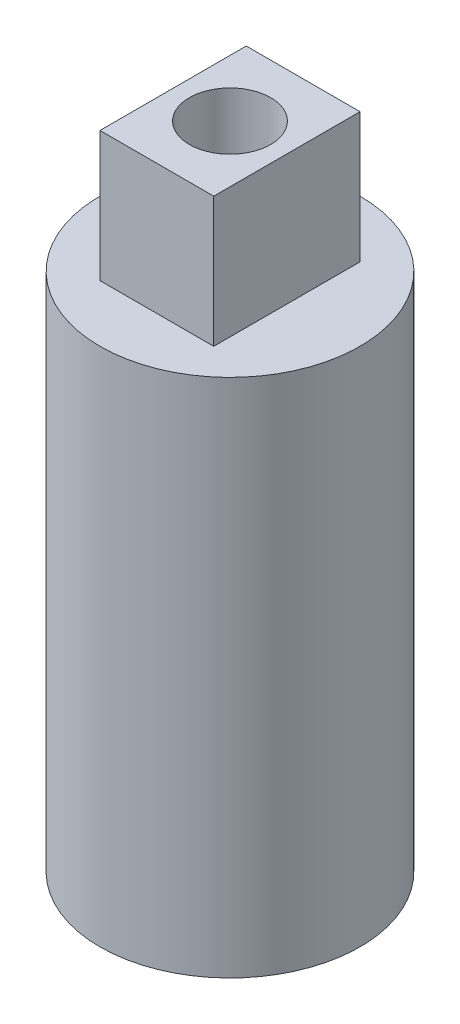
ISO-10303-21;
HEADER;
FILE_DESCRIPTION(('STEP AP214'),'2;1');
FILE_NAME('part.step','',(''),(''),'','','');
FILE_SCHEMA(('AUTOMOTIVE_DESIGN { 1 0 10303 214 1 1 1 1 }'));
ENDSEC;
DATA;
#1=APPLICATION_CONTEXT('core data for automotive mechanical design processes');
#2=APPLICATION_PROTOCOL_DEFINITION('international standard','automotive_design',2000,#1);
#3=PRODUCT_CONTEXT('',#1,'mechanical');
#4=PRODUCT('Part','Part','',(#3));
#5=PRODUCT_RELATED_PRODUCT_CATEGORY('part','',(#4));
#6=PRODUCT_DEFINITION_FORMATION('','',#4);
#7=PRODUCT_DEFINITION_CONTEXT('part definition',#1,'design');
#8=PRODUCT_DEFINITION('design','',#6,#7);
#9=PRODUCT_DEFINITION_SHAPE('','',#8);
#10=(LENGTH_UNIT() NAMED_UNIT(*) SI_UNIT(.MILLI.,.METRE.));
#11=(NAMED_UNIT(*) PLANE_ANGLE_UNIT() SI_UNIT($,.RADIAN.));
#12=(NAMED_UNIT(*) SI_UNIT($,.STERADIAN.) SOLID_ANGLE_UNIT());
#13=UNCERTAINTY_MEASURE_WITH_UNIT(LENGTH_MEASURE(1.E-05),#10,'distance_accuracy_value','');
#14=(GEOMETRIC_REPRESENTATION_CONTEXT(3) GLOBAL_UNCERTAINTY_ASSIGNED_CONTEXT((#13)) GLOBAL_UNIT_ASSIGNED_CONTEXT((#10,
#11,#12)) REPRESENTATION_CONTEXT('',''));
#15=CARTESIAN_POINT('',(0.,0.,0.));
#16=DIRECTION('',(0.,0.,1.));
#17=DIRECTION('',(1.,0.,0.));
#18=AXIS2_PLACEMENT_3D('',#15,#16,#17);
#19=CARTESIAN_POINT('',(0.,0.,0.));
#20=DIRECTION('',(0.,1.,0.));
#21=DIRECTION('',(0.,0.,1.));
#22=AXIS2_PLACEMENT_3D('',#19,#20,#21);
#23=PLANE('',#22);
#24=CARTESIAN_POINT('',(0.,0.,0.));
#25=DIRECTION('',(0.,1.,0.));
#26=DIRECTION('',(0.,0.,1.));
#27=AXIS2_PLACEMENT_3D('',#24,#25,#26);
#28=CIRCLE('',#27,12.5);
#29=CARTESIAN_POINT('',(0.,0.,12.5));
#30=VERTEX_POINT('',#29);
#31=EDGE_CURVE('E160',#30,#30,#28,.T.);
#32=ORIENTED_EDGE('',*,*,#31,.T.);
#33=EDGE_LOOP('',(#32));
#34=FACE_BOUND('',#33,.T.);
#35=CARTESIAN_POINT('',(0.,0.,0.));
#36=DIRECTION('',(0.,1.,0.));
#37=DIRECTION('',(0.,0.,1.));
#38=AXIS2_PLACEMENT_3D('',#35,#36,#37);
#39=CIRCLE('',#38,13.5);
#40=CARTESIAN_POINT('',(0.,0.,13.5));
#41=VERTEX_POINT('',#40);
#42=EDGE_CURVE('E154',#41,#41,#39,.T.);
#43=ORIENTED_EDGE('',*,*,#42,.F.);
#44=EDGE_LOOP('',(#43));
#45=FACE_BOUND('',#44,.T.);
#46=ADVANCED_FACE('F37',(#34,#45),#23,.F.);
#47=CARTESIAN_POINT('',(0.,160.,0.));
#48=DIRECTION('',(0.,1.,0.));
#49=DIRECTION('',(0.,0.,1.));
#50=AXIS2_PLACEMENT_3D('',#47,#48,#49);
#51=PLANE('',#50);
#52=CARTESIAN_POINT('',(0.,160.,0.));
#53=DIRECTION('',(0.,1.,0.));
#54=DIRECTION('',(0.,0.,1.));
#55=AXIS2_PLACEMENT_3D('',#52,#53,#54);
#56=CIRCLE('',#55,40.);
#57=CARTESIAN_POINT('',(0.,160.,40.));
#58=VERTEX_POINT('',#57);
#59=EDGE_CURVE('E11',#58,#58,#56,.T.);
#60=ORIENTED_EDGE('',*,*,#59,.T.);
#61=EDGE_LOOP('',(#60));
#62=FACE_BOUND('',#61,.T.);
#63=DIRECTION('',(1.,0.,0.));
#64=VECTOR('',#63,1.);
#65=CARTESIAN_POINT('',(17.5,160.,22.5));
#66=LINE('',#65,#64);
#67=CARTESIAN_POINT('',(-17.5,160.,22.5));
#68=VERTEX_POINT('',#67);
#69=CARTESIAN_POINT('',(17.5,160.,22.5));
#70=VERTEX_POINT('',#69);
#71=EDGE_CURVE('E176',#68,#70,#66,.T.);
#72=ORIENTED_EDGE('',*,*,#71,.F.);
#73=DIRECTION('',(0.,0.,1.));
#74=VECTOR('',#73,1.);
#75=CARTESIAN_POINT('',(-17.5,160.,-22.5));
#76=LINE('',#75,#74);
#77=CARTESIAN_POINT('',(-17.5,160.,-22.5));
#78=VERTEX_POINT('',#77);
#79=EDGE_CURVE('E163',#78,#68,#76,.T.);
#80=ORIENTED_EDGE('',*,*,#79,.F.);
#81=DIRECTION('',(-1.,0.,0.));
#82=VECTOR('',#81,1.);
#83=CARTESIAN_POINT('',(17.5,160.,-22.5));
#84=LINE('',#83,#82);
#85=CARTESIAN_POINT('',(17.5,160.,-22.5));
#86=VERTEX_POINT('',#85);
#87=EDGE_CURVE('E75',#86,#78,#84,.T.);
#88=ORIENTED_EDGE('',*,*,#87,.F.);
#89=DIRECTION('',(0.,0.,-1.));
#90=VECTOR('',#89,1.);
#91=CARTESIAN_POINT('',(17.5,160.,-22.5));
#92=LINE('',#91,#90);
#93=EDGE_CURVE('E178',#70,#86,#92,.T.);
#94=ORIENTED_EDGE('',*,*,#93,.F.);
#95=EDGE_LOOP('',(#72,#80,#88,#94));
#96=FACE_BOUND('',#95,.T.);
#97=ADVANCED_FACE('F205',(#62,#96),#51,.T.);
#98=CARTESIAN_POINT('',(0.,160.,0.));
#99=DIRECTION('',(0.,-1.,0.));
#100=DIRECTION('',(0.,0.,-1.));
#101=AXIS2_PLACEMENT_3D('',#98,#99,#100);
#102=CYLINDRICAL_SURFACE('',#101,40.);
#103=ORIENTED_EDGE('',*,*,#59,.F.);
#104=EDGE_LOOP('',(#103));
#105=FACE_BOUND('',#104,.T.);
#106=CARTESIAN_POINT('',(0.,0.,0.));
#107=DIRECTION('',(0.,1.,0.));
#108=DIRECTION('',(0.,0.,1.));
#109=AXIS2_PLACEMENT_3D('',#106,#107,#108);
#110=CIRCLE('',#109,40.);
#111=CARTESIAN_POINT('',(0.,0.,40.));
#112=VERTEX_POINT('',#111);
#113=EDGE_CURVE('E41',#112,#112,#110,.T.);
#114=ORIENTED_EDGE('',*,*,#113,.T.);
#115=EDGE_LOOP('',(#114));
#116=FACE_BOUND('',#115,.T.);
#117=ADVANCED_FACE('F39',(#105,#116),#102,.T.);
#118=CARTESIAN_POINT('',(0.,0.,0.));
#119=DIRECTION('',(0.,1.,0.));
#120=DIRECTION('',(0.,0.,1.));
#121=AXIS2_PLACEMENT_3D('',#118,#119,#120);
#122=CIRCLE('',#121,39.);
#123=CARTESIAN_POINT('',(0.,0.,39.));
#124=VERTEX_POINT('',#123);
#125=EDGE_CURVE('E139',#124,#124,#122,.T.);
#126=ORIENTED_EDGE('',*,*,#125,.T.);
#127=EDGE_LOOP('',(#126));
#128=FACE_BOUND('',#127,.T.);
#129=ORIENTED_EDGE('',*,*,#113,.F.);
#130=EDGE_LOOP('',(#129));
#131=FACE_BOUND('',#130,.T.);
#132=ADVANCED_FACE('F192',(#128,#131),#23,.F.);
#133=CARTESIAN_POINT('',(-17.5,200.,-22.5));
#134=DIRECTION('',(1.,0.,0.));
#135=DIRECTION('',(0.,0.,-1.));
#136=AXIS2_PLACEMENT_3D('',#133,#134,#135);
#137=PLANE('',#136);
#138=ORIENTED_EDGE('',*,*,#79,.T.);
#139=DIRECTION('',(0.,-1.,0.));
#140=VECTOR('',#139,1.);
#141=CARTESIAN_POINT('',(-17.5,200.,22.5));
#142=LINE('',#141,#140);
#143=CARTESIAN_POINT('',(-17.5,200.,22.5));
#144=VERTEX_POINT('',#143);
#145=EDGE_CURVE('E186',#144,#68,#142,.T.);
#146=ORIENTED_EDGE('',*,*,#145,.F.);
#147=DIRECTION('',(0.,0.,1.));
#148=VECTOR('',#147,1.);
#149=CARTESIAN_POINT('',(-17.5,200.,-22.5));
#150=LINE('',#149,#148);
#151=CARTESIAN_POINT('',(-17.5,200.,-22.5));
#152=VERTEX_POINT('',#151);
#153=EDGE_CURVE('E167',#152,#144,#150,.T.);
#154=ORIENTED_EDGE('',*,*,#153,.F.);
#155=DIRECTION('',(0.,-1.,0.));
#156=VECTOR('',#155,1.);
#157=CARTESIAN_POINT('',(-17.5,200.,-22.5));
#158=LINE('',#157,#156);
#159=EDGE_CURVE('E173',#152,#78,#158,.T.);
#160=ORIENTED_EDGE('',*,*,#159,.T.);
#161=EDGE_LOOP('',(#138,#146,#154,#160));
#162=FACE_BOUND('',#161,.T.);
#163=ADVANCED_FACE('F194',(#162),#137,.F.);
#164=CARTESIAN_POINT('',(17.5,200.,22.5));
#165=DIRECTION('',(0.,0.,-1.));
#166=DIRECTION('',(-1.,0.,0.));
#167=AXIS2_PLACEMENT_3D('',#164,#165,#166);
#168=PLANE('',#167);
#169=ORIENTED_EDGE('',*,*,#71,.T.);
#170=DIRECTION('',(0.,-1.,0.));
#171=VECTOR('',#170,1.);
#172=CARTESIAN_POINT('',(17.5,200.,22.5));
#173=LINE('',#172,#171);
#174=CARTESIAN_POINT('',(17.5,200.,22.5));
#175=VERTEX_POINT('',#174);
#176=EDGE_CURVE('E183',#175,#70,#173,.T.);
#177=ORIENTED_EDGE('',*,*,#176,.F.);
#178=DIRECTION('',(1.,0.,0.));
#179=VECTOR('',#178,1.);
#180=CARTESIAN_POINT('',(17.5,200.,22.5));
#181=LINE('',#180,#179);
#182=EDGE_CURVE('E82',#144,#175,#181,.T.);
#183=ORIENTED_EDGE('',*,*,#182,.F.);
#184=ORIENTED_EDGE('',*,*,#145,.T.);
#185=EDGE_LOOP('',(#169,#177,#183,#184));
#186=FACE_BOUND('',#185,.T.);
#187=ADVANCED_FACE('F201',(#186),#168,.F.);
#188=CARTESIAN_POINT('',(17.5,200.,-22.5));
#189=DIRECTION('',(-1.,0.,0.));
#190=DIRECTION('',(0.,0.,1.));
#191=AXIS2_PLACEMENT_3D('',#188,#189,#190);
#192=PLANE('',#191);
#193=ORIENTED_EDGE('',*,*,#93,.T.);
#194=DIRECTION('',(0.,-1.,0.));
#195=VECTOR('',#194,1.);
#196=CARTESIAN_POINT('',(17.5,200.,-22.5));
#197=LINE('',#196,#195);
#198=CARTESIAN_POINT('',(17.5,200.,-22.5));
#199=VERTEX_POINT('',#198);
#200=EDGE_CURVE('E52',#199,#86,#197,.T.);
#201=ORIENTED_EDGE('',*,*,#200,.F.);
#202=DIRECTION('',(0.,0.,-1.));
#203=VECTOR('',#202,1.);
#204=CARTESIAN_POINT('',(17.5,200.,-22.5));
#205=LINE('',#204,#203);
#206=EDGE_CURVE('E170',#175,#199,#205,.T.);
#207=ORIENTED_EDGE('',*,*,#206,.F.);
#208=ORIENTED_EDGE('',*,*,#176,.T.);
#209=EDGE_LOOP('',(#193,#201,#207,#208));
#210=FACE_BOUND('',#209,.T.);
#211=ADVANCED_FACE('F254',(#210),#192,.F.);
#212=CARTESIAN_POINT('',(17.5,200.,-22.5));
#213=DIRECTION('',(0.,0.,1.));
#214=DIRECTION('',(1.,0.,0.));
#215=AXIS2_PLACEMENT_3D('',#212,#213,#214);
#216=PLANE('',#215);
#217=ORIENTED_EDGE('',*,*,#87,.T.);
#218=ORIENTED_EDGE('',*,*,#159,.F.);
#219=DIRECTION('',(-1.,0.,0.));
#220=VECTOR('',#219,1.);
#221=CARTESIAN_POINT('',(17.5,200.,-22.5));
#222=LINE('',#221,#220);
#223=EDGE_CURVE('E60',#199,#152,#222,.T.);
#224=ORIENTED_EDGE('',*,*,#223,.F.);
#225=ORIENTED_EDGE('',*,*,#200,.T.);
#226=EDGE_LOOP('',(#217,#218,#224,#225));
#227=FACE_BOUND('',#226,.T.);
#228=ADVANCED_FACE('F250',(#227),#216,.F.);
#229=CARTESIAN_POINT('',(0.,200.,0.));
#230=DIRECTION('',(0.,-1.,0.));
#231=DIRECTION('',(0.,0.,-1.));
#232=AXIS2_PLACEMENT_3D('',#229,#230,#231);
#233=PLANE('',#232);
#234=CARTESIAN_POINT('',(0.,200.,0.));
#235=DIRECTION('',(0.,1.,0.));
#236=DIRECTION('',(0.,0.,1.));
#237=AXIS2_PLACEMENT_3D('',#234,#235,#236);
#238=CIRCLE('',#237,12.5);
#239=CARTESIAN_POINT('',(0.,200.,12.5));
#240=VERTEX_POINT('',#239);
#241=EDGE_CURVE('E164',#240,#240,#238,.T.);
#242=ORIENTED_EDGE('',*,*,#241,.F.);
#243=EDGE_LOOP('',(#242));
#244=FACE_BOUND('',#243,.T.);
#245=ORIENTED_EDGE('',*,*,#153,.T.);
#246=ORIENTED_EDGE('',*,*,#182,.T.);
#247=ORIENTED_EDGE('',*,*,#206,.T.);
#248=ORIENTED_EDGE('',*,*,#223,.T.);
#249=EDGE_LOOP('',(#245,#246,#247,#248));
#250=FACE_BOUND('',#249,.T.);
#251=ADVANCED_FACE('F246',(#244,#250),#233,.F.);
#252=CARTESIAN_POINT('',(0.,0.,0.));
#253=DIRECTION('',(0.,1.,0.));
#254=DIRECTION('',(0.,0.,1.));
#255=AXIS2_PLACEMENT_3D('',#252,#253,#254);
#256=CYLINDRICAL_SURFACE('',#255,12.5);
#257=ORIENTED_EDGE('',*,*,#31,.F.);
#258=EDGE_LOOP('',(#257));
#259=FACE_BOUND('',#258,.T.);
#260=ORIENTED_EDGE('',*,*,#241,.T.);
#261=EDGE_LOOP('',(#260));
#262=FACE_BOUND('',#261,.T.);
#263=ADVANCED_FACE('F243',(#259,#262),#256,.F.);
#264=CARTESIAN_POINT('',(0.,159.,0.));
#265=DIRECTION('',(0.,1.,0.));
#266=DIRECTION('',(0.,0.,1.));
#267=AXIS2_PLACEMENT_3D('',#264,#265,#266);
#268=PLANE('',#267);
#269=CARTESIAN_POINT('',(0.,159.,0.));
#270=DIRECTION('',(0.,1.,0.));
#271=DIRECTION('',(0.,0.,1.));
#272=AXIS2_PLACEMENT_3D('',#269,#270,#271);
#273=CIRCLE('',#272,39.);
#274=CARTESIAN_POINT('',(0.,159.,39.));
#275=VERTEX_POINT('',#274);
#276=EDGE_CURVE('E157',#275,#275,#273,.T.);
#277=ORIENTED_EDGE('',*,*,#276,.F.);
#278=EDGE_LOOP('',(#277));
#279=FACE_BOUND('',#278,.T.);
#280=DIRECTION('',(1.,0.,0.));
#281=VECTOR('',#280,1.);
#282=CARTESIAN_POINT('',(17.5,159.,21.5));
#283=LINE('',#282,#281);
#284=CARTESIAN_POINT('',(-16.5,159.,21.5));
#285=VERTEX_POINT('',#284);
#286=CARTESIAN_POINT('',(16.5,159.,21.5));
#287=VERTEX_POINT('',#286);
#288=EDGE_CURVE('E110',#285,#287,#283,.T.);
#289=ORIENTED_EDGE('',*,*,#288,.T.);
#290=DIRECTION('',(0.,0.,-1.));
#291=VECTOR('',#290,1.);
#292=CARTESIAN_POINT('',(16.5,159.,-22.5));
#293=LINE('',#292,#291);
#294=CARTESIAN_POINT('',(16.5,159.,-21.5));
#295=VERTEX_POINT('',#294);
#296=EDGE_CURVE('E114',#287,#295,#293,.T.);
#297=ORIENTED_EDGE('',*,*,#296,.T.);
#298=DIRECTION('',(-1.,0.,0.));
#299=VECTOR('',#298,1.);
#300=CARTESIAN_POINT('',(17.5,159.,-21.5));
#301=LINE('',#300,#299);
#302=CARTESIAN_POINT('',(-16.5,159.,-21.5));
#303=VERTEX_POINT('',#302);
#304=EDGE_CURVE('E132',#295,#303,#301,.T.);
#305=ORIENTED_EDGE('',*,*,#304,.T.);
#306=DIRECTION('',(0.,0.,1.));
#307=VECTOR('',#306,1.);
#308=CARTESIAN_POINT('',(-16.5,159.,-22.5));
#309=LINE('',#308,#307);
#310=EDGE_CURVE('E117',#303,#285,#309,.T.);
#311=ORIENTED_EDGE('',*,*,#310,.T.);
#312=EDGE_LOOP('',(#289,#297,#305,#311));
#313=FACE_BOUND('',#312,.T.);
#314=ADVANCED_FACE('F112',(#279,#313),#268,.F.);
#315=CARTESIAN_POINT('',(0.,160.,0.));
#316=DIRECTION('',(0.,-1.,0.));
#317=DIRECTION('',(0.,0.,-1.));
#318=AXIS2_PLACEMENT_3D('',#315,#316,#317);
#319=CYLINDRICAL_SURFACE('',#318,39.);
#320=ORIENTED_EDGE('',*,*,#276,.T.);
#321=EDGE_LOOP('',(#320));
#322=FACE_BOUND('',#321,.T.);
#323=ORIENTED_EDGE('',*,*,#125,.F.);
#324=EDGE_LOOP('',(#323));
#325=FACE_BOUND('',#324,.T.);
#326=ADVANCED_FACE('F294',(#322,#325),#319,.F.);
#327=CARTESIAN_POINT('',(-16.5,200.,-22.5));
#328=DIRECTION('',(1.,0.,0.));
#329=DIRECTION('',(0.,0.,-1.));
#330=AXIS2_PLACEMENT_3D('',#327,#328,#329);
#331=PLANE('',#330);
#332=ORIENTED_EDGE('',*,*,#310,.F.);
#333=DIRECTION('',(0.,-1.,0.));
#334=VECTOR('',#333,1.);
#335=CARTESIAN_POINT('',(-16.5,200.,-21.5));
#336=LINE('',#335,#334);
#337=CARTESIAN_POINT('',(-16.5,199.,-21.5));
#338=VERTEX_POINT('',#337);
#339=EDGE_CURVE('E142',#338,#303,#336,.T.);
#340=ORIENTED_EDGE('',*,*,#339,.F.);
#341=DIRECTION('',(0.,0.,1.));
#342=VECTOR('',#341,1.);
#343=CARTESIAN_POINT('',(-16.5,199.,0.));
#344=LINE('',#343,#342);
#345=CARTESIAN_POINT('',(-16.5,199.,21.5));
#346=VERTEX_POINT('',#345);
#347=EDGE_CURVE('E134',#338,#346,#344,.T.);
#348=ORIENTED_EDGE('',*,*,#347,.T.);
#349=DIRECTION('',(0.,-1.,0.));
#350=VECTOR('',#349,1.);
#351=CARTESIAN_POINT('',(-16.5,200.,21.5));
#352=LINE('',#351,#350);
#353=EDGE_CURVE('E127',#346,#285,#352,.T.);
#354=ORIENTED_EDGE('',*,*,#353,.T.);
#355=EDGE_LOOP('',(#332,#340,#348,#354));
#356=FACE_BOUND('',#355,.T.);
#357=ADVANCED_FACE('F233',(#356),#331,.T.);
#358=CARTESIAN_POINT('',(17.5,200.,21.5));
#359=DIRECTION('',(0.,0.,-1.));
#360=DIRECTION('',(-1.,0.,0.));
#361=AXIS2_PLACEMENT_3D('',#358,#359,#360);
#362=PLANE('',#361);
#363=ORIENTED_EDGE('',*,*,#288,.F.);
#364=ORIENTED_EDGE('',*,*,#353,.F.);
#365=DIRECTION('',(1.,0.,0.));
#366=VECTOR('',#365,1.);
#367=CARTESIAN_POINT('',(0.,199.,21.5));
#368=LINE('',#367,#366);
#369=CARTESIAN_POINT('',(16.5,199.,21.5));
#370=VERTEX_POINT('',#369);
#371=EDGE_CURVE('E124',#346,#370,#368,.T.);
#372=ORIENTED_EDGE('',*,*,#371,.T.);
#373=DIRECTION('',(0.,-1.,0.));
#374=VECTOR('',#373,1.);
#375=CARTESIAN_POINT('',(16.5,200.,21.5));
#376=LINE('',#375,#374);
#377=EDGE_CURVE('E122',#370,#287,#376,.T.);
#378=ORIENTED_EDGE('',*,*,#377,.T.);
#379=EDGE_LOOP('',(#363,#364,#372,#378));
#380=FACE_BOUND('',#379,.T.);
#381=ADVANCED_FACE('F123',(#380),#362,.T.);
#382=CARTESIAN_POINT('',(16.5,200.,-22.5));
#383=DIRECTION('',(-1.,0.,0.));
#384=DIRECTION('',(0.,0.,1.));
#385=AXIS2_PLACEMENT_3D('',#382,#383,#384);
#386=PLANE('',#385);
#387=ORIENTED_EDGE('',*,*,#296,.F.);
#388=ORIENTED_EDGE('',*,*,#377,.F.);
#389=DIRECTION('',(0.,0.,-1.));
#390=VECTOR('',#389,1.);
#391=CARTESIAN_POINT('',(16.5,199.,0.));
#392=LINE('',#391,#390);
#393=CARTESIAN_POINT('',(16.5,199.,-21.5));
#394=VERTEX_POINT('',#393);
#395=EDGE_CURVE('E147',#370,#394,#392,.T.);
#396=ORIENTED_EDGE('',*,*,#395,.T.);
#397=DIRECTION('',(0.,-1.,0.));
#398=VECTOR('',#397,1.);
#399=CARTESIAN_POINT('',(16.5,200.,-21.5));
#400=LINE('',#399,#398);
#401=EDGE_CURVE('E128',#394,#295,#400,.T.);
#402=ORIENTED_EDGE('',*,*,#401,.T.);
#403=EDGE_LOOP('',(#387,#388,#396,#402));
#404=FACE_BOUND('',#403,.T.);
#405=ADVANCED_FACE('F130',(#404),#386,.T.);
#406=CARTESIAN_POINT('',(17.5,200.,-21.5));
#407=DIRECTION('',(0.,0.,1.));
#408=DIRECTION('',(1.,0.,0.));
#409=AXIS2_PLACEMENT_3D('',#406,#407,#408);
#410=PLANE('',#409);
#411=ORIENTED_EDGE('',*,*,#304,.F.);
#412=ORIENTED_EDGE('',*,*,#401,.F.);
#413=DIRECTION('',(-1.,0.,0.));
#414=VECTOR('',#413,1.);
#415=CARTESIAN_POINT('',(0.,199.,-21.5));
#416=LINE('',#415,#414);
#417=EDGE_CURVE('E144',#394,#338,#416,.T.);
#418=ORIENTED_EDGE('',*,*,#417,.T.);
#419=ORIENTED_EDGE('',*,*,#339,.T.);
#420=EDGE_LOOP('',(#411,#412,#418,#419));
#421=FACE_BOUND('',#420,.T.);
#422=ADVANCED_FACE('F227',(#421),#410,.T.);
#423=CARTESIAN_POINT('',(0.,199.,0.));
#424=DIRECTION('',(0.,-1.,0.));
#425=DIRECTION('',(0.,0.,-1.));
#426=AXIS2_PLACEMENT_3D('',#423,#424,#425);
#427=PLANE('',#426);
#428=CARTESIAN_POINT('',(0.,199.,0.));
#429=DIRECTION('',(0.,-1.,0.));
#430=DIRECTION('',(0.,0.,-1.));
#431=AXIS2_PLACEMENT_3D('',#428,#429,#430);
#432=CIRCLE('',#431,13.5);
#433=CARTESIAN_POINT('',(0.,199.,-13.5));
#434=VERTEX_POINT('',#433);
#435=EDGE_CURVE('E151',#434,#434,#432,.F.);
#436=ORIENTED_EDGE('',*,*,#435,.T.);
#437=EDGE_LOOP('',(#436));
#438=FACE_BOUND('',#437,.T.);
#439=ORIENTED_EDGE('',*,*,#347,.F.);
#440=ORIENTED_EDGE('',*,*,#417,.F.);
#441=ORIENTED_EDGE('',*,*,#395,.F.);
#442=ORIENTED_EDGE('',*,*,#371,.F.);
#443=EDGE_LOOP('',(#439,#440,#441,#442));
#444=FACE_BOUND('',#443,.T.);
#445=ADVANCED_FACE('F221',(#438,#444),#427,.T.);
#446=CARTESIAN_POINT('',(0.,0.,0.));
#447=DIRECTION('',(0.,1.,0.));
#448=DIRECTION('',(0.,0.,1.));
#449=AXIS2_PLACEMENT_3D('',#446,#447,#448);
#450=CYLINDRICAL_SURFACE('',#449,13.5);
#451=ORIENTED_EDGE('',*,*,#42,.T.);
#452=EDGE_LOOP('',(#451));
#453=FACE_BOUND('',#452,.T.);
#454=ORIENTED_EDGE('',*,*,#435,.F.);
#455=EDGE_LOOP('',(#454));
#456=FACE_BOUND('',#455,.T.);
#457=ADVANCED_FACE('F218',(#453,#456),#450,.T.);
#458=CLOSED_SHELL('',(#46,#97,#117,#132,#163,#187,#211,#228,#251,#263,#314,#326,#357,#381,#405,
#422,#445,#457));
#459=MANIFOLD_SOLID_BREP('B2',#458);
#460=ADVANCED_BREP_SHAPE_REPRESENTATION('',(#18,#459),#14);
#461=SHAPE_DEFINITION_REPRESENTATION(#9,#460);
ENDSEC;
END-ISO-10303-21;
